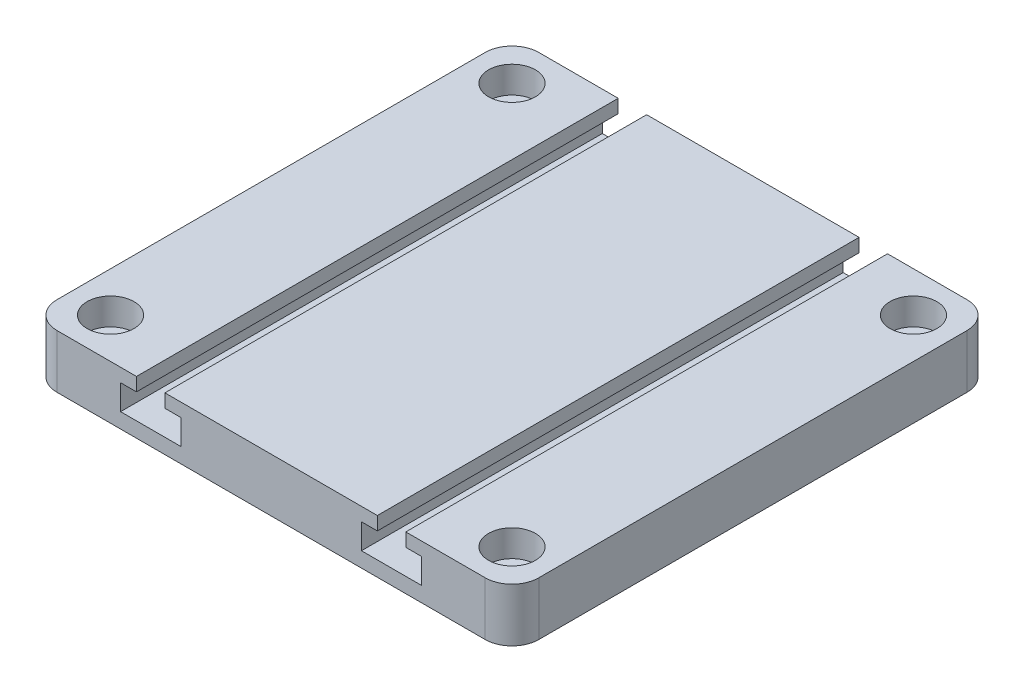
ISO-10303-21;
HEADER;
FILE_DESCRIPTION(('STEP AP214'),'2;1');
FILE_NAME('part.step','',(''),(''),'','','');
FILE_SCHEMA(('AUTOMOTIVE_DESIGN { 1 0 10303 214 1 1 1 1 }'));
ENDSEC;
DATA;
#1=APPLICATION_CONTEXT('core data for automotive mechanical design processes');
#2=APPLICATION_PROTOCOL_DEFINITION('international standard','automotive_design',2000,#1);
#3=PRODUCT_CONTEXT('',#1,'mechanical');
#4=PRODUCT('Part','Part','',(#3));
#5=PRODUCT_RELATED_PRODUCT_CATEGORY('part','',(#4));
#6=PRODUCT_DEFINITION_FORMATION('','',#4);
#7=PRODUCT_DEFINITION_CONTEXT('part definition',#1,'design');
#8=PRODUCT_DEFINITION('design','',#6,#7);
#9=PRODUCT_DEFINITION_SHAPE('','',#8);
#10=(LENGTH_UNIT() NAMED_UNIT(*) SI_UNIT(.MILLI.,.METRE.));
#11=(NAMED_UNIT(*) PLANE_ANGLE_UNIT() SI_UNIT($,.RADIAN.));
#12=(NAMED_UNIT(*) SI_UNIT($,.STERADIAN.) SOLID_ANGLE_UNIT());
#13=UNCERTAINTY_MEASURE_WITH_UNIT(LENGTH_MEASURE(1.E-05),#10,'distance_accuracy_value','');
#14=(GEOMETRIC_REPRESENTATION_CONTEXT(3) GLOBAL_UNCERTAINTY_ASSIGNED_CONTEXT((#13)) GLOBAL_UNIT_ASSIGNED_CONTEXT((#10,
#11,#12)) REPRESENTATION_CONTEXT('',''));
#15=CARTESIAN_POINT('',(0.,0.,0.));
#16=DIRECTION('',(0.,0.,1.));
#17=DIRECTION('',(1.,0.,0.));
#18=AXIS2_PLACEMENT_3D('',#15,#16,#17);
#19=CARTESIAN_POINT('',(0.,12.7,0.));
#20=DIRECTION('',(0.,1.,0.));
#21=DIRECTION('',(0.,0.,1.));
#22=AXIS2_PLACEMENT_3D('',#19,#20,#21);
#23=PLANE('',#22);
#24=DIRECTION('',(0.,0.,1.));
#25=VECTOR('',#24,1.);
#26=CARTESIAN_POINT('',(-25.2015625,12.7,-57.15));
#27=LINE('',#26,#25);
#28=CARTESIAN_POINT('',(-25.2015625,12.7,-57.15));
#29=VERTEX_POINT('',#28);
#30=CARTESIAN_POINT('',(-25.2015625,12.7,57.15));
#31=VERTEX_POINT('',#30);
#32=EDGE_CURVE('E276',#29,#31,#27,.T.);
#33=ORIENTED_EDGE('',*,*,#32,.T.);
#34=DIRECTION('',(1.,0.,0.));
#35=VECTOR('',#34,1.);
#36=CARTESIAN_POINT('',(-57.15,12.7,57.15));
#37=LINE('',#36,#35);
#38=CARTESIAN_POINT('',(25.2015625,12.7,57.15));
#39=VERTEX_POINT('',#38);
#40=EDGE_CURVE('E408',#31,#39,#37,.T.);
#41=ORIENTED_EDGE('',*,*,#40,.T.);
#42=DIRECTION('',(0.,0.,1.));
#43=VECTOR('',#42,1.);
#44=CARTESIAN_POINT('',(25.2015625,12.7,-57.15));
#45=LINE('',#44,#43);
#46=CARTESIAN_POINT('',(25.2015625,12.7,-57.15));
#47=VERTEX_POINT('',#46);
#48=EDGE_CURVE('E333',#47,#39,#45,.T.);
#49=ORIENTED_EDGE('',*,*,#48,.F.);
#50=DIRECTION('',(-1.,0.,0.));
#51=VECTOR('',#50,1.);
#52=CARTESIAN_POINT('',(-57.15,12.7,-57.15));
#53=LINE('',#52,#51);
#54=EDGE_CURVE('E401',#47,#29,#53,.T.);
#55=ORIENTED_EDGE('',*,*,#54,.T.);
#56=EDGE_LOOP('',(#33,#41,#49,#55));
#57=FACE_BOUND('',#56,.T.);
#58=ADVANCED_FACE('F54',(#57),#23,.T.);
#59=DIRECTION('',(0.,0.,1.));
#60=VECTOR('',#59,1.);
#61=CARTESIAN_POINT('',(-57.15,12.7,-57.15));
#62=LINE('',#61,#60);
#63=CARTESIAN_POINT('',(-57.15,12.7,-50.8));
#64=VERTEX_POINT('',#63);
#65=CARTESIAN_POINT('',(-57.15,12.7,50.8));
#66=VERTEX_POINT('',#65);
#67=EDGE_CURVE('E400',#64,#66,#62,.T.);
#68=ORIENTED_EDGE('',*,*,#67,.T.);
#69=CARTESIAN_POINT('',(-50.8,12.7,50.8));
#70=DIRECTION('',(0.,1.,0.));
#71=DIRECTION('',(0.,0.,1.));
#72=AXIS2_PLACEMENT_3D('',#69,#70,#71);
#73=CIRCLE('',#72,6.35);
#74=CARTESIAN_POINT('',(-50.8,12.7,57.15));
#75=VERTEX_POINT('',#74);
#76=EDGE_CURVE('E437',#66,#75,#73,.T.);
#77=ORIENTED_EDGE('',*,*,#76,.T.);
#78=CARTESIAN_POINT('',(-31.9484375,12.7,57.15));
#79=VERTEX_POINT('',#78);
#80=EDGE_CURVE('E405',#75,#79,#37,.T.);
#81=ORIENTED_EDGE('',*,*,#80,.T.);
#82=DIRECTION('',(0.,0.,1.));
#83=VECTOR('',#82,1.);
#84=CARTESIAN_POINT('',(-31.9484375,12.7,-57.15));
#85=LINE('',#84,#83);
#86=CARTESIAN_POINT('',(-31.9484375,12.7,-57.15));
#87=VERTEX_POINT('',#86);
#88=EDGE_CURVE('E229',#87,#79,#85,.T.);
#89=ORIENTED_EDGE('',*,*,#88,.F.);
#90=CARTESIAN_POINT('',(-50.8,12.7,-57.15));
#91=VERTEX_POINT('',#90);
#92=EDGE_CURVE('E242',#87,#91,#53,.T.);
#93=ORIENTED_EDGE('',*,*,#92,.T.);
#94=CARTESIAN_POINT('',(-50.8,12.7,-50.8));
#95=DIRECTION('',(0.,1.,0.));
#96=DIRECTION('',(0.,0.,1.));
#97=AXIS2_PLACEMENT_3D('',#94,#95,#96);
#98=CIRCLE('',#97,6.35);
#99=EDGE_CURVE('E435',#91,#64,#98,.T.);
#100=ORIENTED_EDGE('',*,*,#99,.T.);
#101=EDGE_LOOP('',(#68,#77,#81,#89,#93,#100));
#102=FACE_BOUND('',#101,.T.);
#103=CARTESIAN_POINT('',(-47.625,12.7,47.625));
#104=DIRECTION('',(0.,1.,0.));
#105=DIRECTION('',(0.,0.,1.));
#106=AXIS2_PLACEMENT_3D('',#103,#104,#105);
#107=CIRCLE('',#106,5.55625);
#108=CARTESIAN_POINT('',(-47.625,12.7,53.18125));
#109=VERTEX_POINT('',#108);
#110=EDGE_CURVE('E382',#109,#109,#107,.T.);
#111=ORIENTED_EDGE('',*,*,#110,.F.);
#112=EDGE_LOOP('',(#111));
#113=FACE_BOUND('',#112,.T.);
#114=CARTESIAN_POINT('',(-47.625,12.7,-47.625));
#115=DIRECTION('',(0.,1.,0.));
#116=DIRECTION('',(0.,0.,1.));
#117=AXIS2_PLACEMENT_3D('',#114,#115,#116);
#118=CIRCLE('',#117,5.55625);
#119=CARTESIAN_POINT('',(-47.625,12.7,-42.06875));
#120=VERTEX_POINT('',#119);
#121=EDGE_CURVE('E279',#120,#120,#118,.T.);
#122=ORIENTED_EDGE('',*,*,#121,.F.);
#123=EDGE_LOOP('',(#122));
#124=FACE_BOUND('',#123,.T.);
#125=ADVANCED_FACE('F450',(#102,#113,#124),#23,.T.);
#126=CARTESIAN_POINT('',(57.15,12.7,-57.15));
#127=DIRECTION('',(-1.,0.,0.));
#128=DIRECTION('',(0.,0.,1.));
#129=AXIS2_PLACEMENT_3D('',#126,#127,#128);
#130=PLANE('',#129);
#131=DIRECTION('',(0.,0.,-1.));
#132=VECTOR('',#131,1.);
#133=CARTESIAN_POINT('',(57.15,12.7,-57.15));
#134=LINE('',#133,#132);
#135=CARTESIAN_POINT('',(57.15,12.7,50.8));
#136=VERTEX_POINT('',#135);
#137=CARTESIAN_POINT('',(57.15,12.7,-50.8));
#138=VERTEX_POINT('',#137);
#139=EDGE_CURVE('E395',#136,#138,#134,.T.);
#140=ORIENTED_EDGE('',*,*,#139,.F.);
#141=DIRECTION('',(0.,-1.,0.));
#142=VECTOR('',#141,1.);
#143=CARTESIAN_POINT('',(57.15,12.7,50.8));
#144=LINE('',#143,#142);
#145=CARTESIAN_POINT('',(57.15,0.,50.8));
#146=VERTEX_POINT('',#145);
#147=EDGE_CURVE('E440',#136,#146,#144,.T.);
#148=ORIENTED_EDGE('',*,*,#147,.T.);
#149=DIRECTION('',(0.,0.,-1.));
#150=VECTOR('',#149,1.);
#151=CARTESIAN_POINT('',(57.15,0.,-57.15));
#152=LINE('',#151,#150);
#153=CARTESIAN_POINT('',(57.15,0.,-50.8));
#154=VERTEX_POINT('',#153);
#155=EDGE_CURVE('E394',#146,#154,#152,.T.);
#156=ORIENTED_EDGE('',*,*,#155,.T.);
#157=DIRECTION('',(0.,-1.,0.));
#158=VECTOR('',#157,1.);
#159=CARTESIAN_POINT('',(57.15,12.7,-50.8));
#160=LINE('',#159,#158);
#161=EDGE_CURVE('E77',#154,#138,#160,.F.);
#162=ORIENTED_EDGE('',*,*,#161,.T.);
#163=EDGE_LOOP('',(#140,#148,#156,#162));
#164=FACE_BOUND('',#163,.T.);
#165=ADVANCED_FACE('F529',(#164),#130,.F.);
#166=CARTESIAN_POINT('',(-57.15,12.7,-57.15));
#167=DIRECTION('',(0.,0.,1.));
#168=DIRECTION('',(1.,0.,0.));
#169=AXIS2_PLACEMENT_3D('',#166,#167,#168);
#170=PLANE('',#169);
#171=CARTESIAN_POINT('',(50.8,12.7,-57.15));
#172=VERTEX_POINT('',#171);
#173=CARTESIAN_POINT('',(31.9484375,12.7,-57.15));
#174=VERTEX_POINT('',#173);
#175=EDGE_CURVE('E398',#172,#174,#53,.T.);
#176=ORIENTED_EDGE('',*,*,#175,.F.);
#177=DIRECTION('',(0.,-1.,0.));
#178=VECTOR('',#177,1.);
#179=CARTESIAN_POINT('',(50.8,12.7,-57.15));
#180=LINE('',#179,#178);
#181=CARTESIAN_POINT('',(50.8,0.,-57.15));
#182=VERTEX_POINT('',#181);
#183=EDGE_CURVE('E13',#172,#182,#180,.T.);
#184=ORIENTED_EDGE('',*,*,#183,.T.);
#185=DIRECTION('',(-1.,0.,0.));
#186=VECTOR('',#185,1.);
#187=CARTESIAN_POINT('',(-57.15,0.,-57.15));
#188=LINE('',#187,#186);
#189=CARTESIAN_POINT('',(-50.8,0.,-57.15));
#190=VERTEX_POINT('',#189);
#191=EDGE_CURVE('E410',#182,#190,#188,.T.);
#192=ORIENTED_EDGE('',*,*,#191,.T.);
#193=DIRECTION('',(0.,-1.,0.));
#194=VECTOR('',#193,1.);
#195=CARTESIAN_POINT('',(-50.8,12.7,-57.15));
#196=LINE('',#195,#194);
#197=EDGE_CURVE('E62',#190,#91,#196,.F.);
#198=ORIENTED_EDGE('',*,*,#197,.T.);
#199=ORIENTED_EDGE('',*,*,#92,.F.);
#200=DIRECTION('',(0.,-1.,0.));
#201=VECTOR('',#200,1.);
#202=CARTESIAN_POINT('',(-31.9484375,12.7,-57.15));
#203=LINE('',#202,#201);
#204=CARTESIAN_POINT('',(-31.9484375,9.525,-57.15));
#205=VERTEX_POINT('',#204);
#206=EDGE_CURVE('E221',#87,#205,#203,.T.);
#207=ORIENTED_EDGE('',*,*,#206,.T.);
#208=DIRECTION('',(-1.,0.,0.));
#209=VECTOR('',#208,1.);
#210=CARTESIAN_POINT('',(-31.9484375,9.525,-57.15));
#211=LINE('',#210,#209);
#212=CARTESIAN_POINT('',(-35.71875,9.525,-57.15));
#213=VERTEX_POINT('',#212);
#214=EDGE_CURVE('E232',#205,#213,#211,.T.);
#215=ORIENTED_EDGE('',*,*,#214,.T.);
#216=DIRECTION('',(0.,-1.,0.));
#217=VECTOR('',#216,1.);
#218=CARTESIAN_POINT('',(-35.71875,9.525,-57.15));
#219=LINE('',#218,#217);
#220=CARTESIAN_POINT('',(-35.71875,3.571875,-57.15));
#221=VERTEX_POINT('',#220);
#222=EDGE_CURVE('E237',#213,#221,#219,.T.);
#223=ORIENTED_EDGE('',*,*,#222,.T.);
#224=DIRECTION('',(1.,0.,0.));
#225=VECTOR('',#224,1.);
#226=CARTESIAN_POINT('',(-35.71875,3.571875,-57.15));
#227=LINE('',#226,#225);
#228=CARTESIAN_POINT('',(-21.43125,3.571875,-57.15));
#229=VERTEX_POINT('',#228);
#230=EDGE_CURVE('E249',#221,#229,#227,.T.);
#231=ORIENTED_EDGE('',*,*,#230,.T.);
#232=DIRECTION('',(0.,1.,0.));
#233=VECTOR('',#232,1.);
#234=CARTESIAN_POINT('',(-21.43125,3.571875,-57.15));
#235=LINE('',#234,#233);
#236=CARTESIAN_POINT('',(-21.43125,9.525,-57.15));
#237=VERTEX_POINT('',#236);
#238=EDGE_CURVE('E252',#229,#237,#235,.T.);
#239=ORIENTED_EDGE('',*,*,#238,.T.);
#240=DIRECTION('',(-1.,0.,0.));
#241=VECTOR('',#240,1.);
#242=CARTESIAN_POINT('',(-21.43125,9.525,-57.15));
#243=LINE('',#242,#241);
#244=CARTESIAN_POINT('',(-25.2015625,9.525,-57.15));
#245=VERTEX_POINT('',#244);
#246=EDGE_CURVE('E255',#237,#245,#243,.T.);
#247=ORIENTED_EDGE('',*,*,#246,.T.);
#248=DIRECTION('',(0.,1.,0.));
#249=VECTOR('',#248,1.);
#250=CARTESIAN_POINT('',(-25.2015625,9.525,-57.15));
#251=LINE('',#250,#249);
#252=EDGE_CURVE('E258',#245,#29,#251,.T.);
#253=ORIENTED_EDGE('',*,*,#252,.T.);
#254=ORIENTED_EDGE('',*,*,#54,.F.);
#255=DIRECTION('',(0.,-1.,0.));
#256=VECTOR('',#255,1.);
#257=CARTESIAN_POINT('',(25.2015625,9.525,-57.15));
#258=LINE('',#257,#256);
#259=CARTESIAN_POINT('',(25.2015625,9.525,-57.15));
#260=VERTEX_POINT('',#259);
#261=EDGE_CURVE('E309',#47,#260,#258,.T.);
#262=ORIENTED_EDGE('',*,*,#261,.T.);
#263=DIRECTION('',(-1.,0.,0.));
#264=VECTOR('',#263,1.);
#265=CARTESIAN_POINT('',(21.43125,9.525,-57.15));
#266=LINE('',#265,#264);
#267=CARTESIAN_POINT('',(21.43125,9.525,-57.15));
#268=VERTEX_POINT('',#267);
#269=EDGE_CURVE('E290',#260,#268,#266,.T.);
#270=ORIENTED_EDGE('',*,*,#269,.T.);
#271=DIRECTION('',(0.,-1.,0.));
#272=VECTOR('',#271,1.);
#273=CARTESIAN_POINT('',(21.43125,3.571875,-57.15));
#274=LINE('',#273,#272);
#275=CARTESIAN_POINT('',(21.43125,3.571875,-57.15));
#276=VERTEX_POINT('',#275);
#277=EDGE_CURVE('E293',#268,#276,#274,.T.);
#278=ORIENTED_EDGE('',*,*,#277,.T.);
#279=DIRECTION('',(1.,0.,0.));
#280=VECTOR('',#279,1.);
#281=CARTESIAN_POINT('',(35.71875,3.571875,-57.15));
#282=LINE('',#281,#280);
#283=CARTESIAN_POINT('',(35.71875,3.571875,-57.15));
#284=VERTEX_POINT('',#283);
#285=EDGE_CURVE('E297',#276,#284,#282,.T.);
#286=ORIENTED_EDGE('',*,*,#285,.T.);
#287=DIRECTION('',(0.,1.,0.));
#288=VECTOR('',#287,1.);
#289=CARTESIAN_POINT('',(35.71875,9.525,-57.15));
#290=LINE('',#289,#288);
#291=CARTESIAN_POINT('',(35.71875,9.525,-57.15));
#292=VERTEX_POINT('',#291);
#293=EDGE_CURVE('E300',#284,#292,#290,.T.);
#294=ORIENTED_EDGE('',*,*,#293,.T.);
#295=DIRECTION('',(-1.,0.,0.));
#296=VECTOR('',#295,1.);
#297=CARTESIAN_POINT('',(31.9484375,9.525,-57.15));
#298=LINE('',#297,#296);
#299=CARTESIAN_POINT('',(31.9484375,9.525,-57.15));
#300=VERTEX_POINT('',#299);
#301=EDGE_CURVE('E303',#292,#300,#298,.T.);
#302=ORIENTED_EDGE('',*,*,#301,.T.);
#303=DIRECTION('',(0.,1.,0.));
#304=VECTOR('',#303,1.);
#305=CARTESIAN_POINT('',(31.9484375,12.7,-57.15));
#306=LINE('',#305,#304);
#307=EDGE_CURVE('E306',#300,#174,#306,.T.);
#308=ORIENTED_EDGE('',*,*,#307,.T.);
#309=EDGE_LOOP('',(#176,#184,#192,#198,#199,#207,#215,#223,#231,#239,#247,#253,#254,#262,#270,
#278,#286,#294,#302,#308));
#310=FACE_BOUND('',#309,.T.);
#311=ADVANCED_FACE('F240',(#310),#170,.F.);
#312=CARTESIAN_POINT('',(-57.15,12.7,-57.15));
#313=DIRECTION('',(1.,0.,0.));
#314=DIRECTION('',(0.,0.,-1.));
#315=AXIS2_PLACEMENT_3D('',#312,#313,#314);
#316=PLANE('',#315);
#317=DIRECTION('',(0.,0.,1.));
#318=VECTOR('',#317,1.);
#319=CARTESIAN_POINT('',(-57.15,0.,-57.15));
#320=LINE('',#319,#318);
#321=CARTESIAN_POINT('',(-57.15,0.,-50.8));
#322=VERTEX_POINT('',#321);
#323=CARTESIAN_POINT('',(-57.15,0.,50.8));
#324=VERTEX_POINT('',#323);
#325=EDGE_CURVE('E413',#322,#324,#320,.T.);
#326=ORIENTED_EDGE('',*,*,#325,.T.);
#327=DIRECTION('',(0.,-1.,0.));
#328=VECTOR('',#327,1.);
#329=CARTESIAN_POINT('',(-57.15,12.7,50.8));
#330=LINE('',#329,#328);
#331=EDGE_CURVE('E433',#324,#66,#330,.F.);
#332=ORIENTED_EDGE('',*,*,#331,.T.);
#333=ORIENTED_EDGE('',*,*,#67,.F.);
#334=DIRECTION('',(0.,-1.,0.));
#335=VECTOR('',#334,1.);
#336=CARTESIAN_POINT('',(-57.15,12.7,-50.8));
#337=LINE('',#336,#335);
#338=EDGE_CURVE('E430',#64,#322,#337,.T.);
#339=ORIENTED_EDGE('',*,*,#338,.T.);
#340=EDGE_LOOP('',(#326,#332,#333,#339));
#341=FACE_BOUND('',#340,.T.);
#342=ADVANCED_FACE('F456',(#341),#316,.F.);
#343=CARTESIAN_POINT('',(-57.15,12.7,57.15));
#344=DIRECTION('',(0.,0.,-1.));
#345=DIRECTION('',(-1.,0.,0.));
#346=AXIS2_PLACEMENT_3D('',#343,#344,#345);
#347=PLANE('',#346);
#348=ORIENTED_EDGE('',*,*,#80,.F.);
#349=DIRECTION('',(0.,-1.,0.));
#350=VECTOR('',#349,1.);
#351=CARTESIAN_POINT('',(-50.8,12.7,57.15));
#352=LINE('',#351,#350);
#353=CARTESIAN_POINT('',(-50.8,0.,57.15));
#354=VERTEX_POINT('',#353);
#355=EDGE_CURVE('E419',#75,#354,#352,.T.);
#356=ORIENTED_EDGE('',*,*,#355,.T.);
#357=DIRECTION('',(1.,0.,0.));
#358=VECTOR('',#357,1.);
#359=CARTESIAN_POINT('',(-57.15,0.,57.15));
#360=LINE('',#359,#358);
#361=CARTESIAN_POINT('',(50.8,0.,57.15));
#362=VERTEX_POINT('',#361);
#363=EDGE_CURVE('E397',#354,#362,#360,.T.);
#364=ORIENTED_EDGE('',*,*,#363,.T.);
#365=DIRECTION('',(0.,-1.,0.));
#366=VECTOR('',#365,1.);
#367=CARTESIAN_POINT('',(50.8,12.7,57.15));
#368=LINE('',#367,#366);
#369=CARTESIAN_POINT('',(50.8,12.7,57.15));
#370=VERTEX_POINT('',#369);
#371=EDGE_CURVE('E407',#362,#370,#368,.F.);
#372=ORIENTED_EDGE('',*,*,#371,.T.);
#373=CARTESIAN_POINT('',(31.9484375,12.7,57.15));
#374=VERTEX_POINT('',#373);
#375=EDGE_CURVE('E404',#374,#370,#37,.T.);
#376=ORIENTED_EDGE('',*,*,#375,.F.);
#377=DIRECTION('',(0.,1.,0.));
#378=VECTOR('',#377,1.);
#379=CARTESIAN_POINT('',(31.9484375,12.7,57.15));
#380=LINE('',#379,#378);
#381=CARTESIAN_POINT('',(31.9484375,9.525,57.15));
#382=VERTEX_POINT('',#381);
#383=EDGE_CURVE('E328',#382,#374,#380,.T.);
#384=ORIENTED_EDGE('',*,*,#383,.F.);
#385=DIRECTION('',(-1.,0.,0.));
#386=VECTOR('',#385,1.);
#387=CARTESIAN_POINT('',(31.9484375,9.525,57.15));
#388=LINE('',#387,#386);
#389=CARTESIAN_POINT('',(35.71875,9.525,57.15));
#390=VERTEX_POINT('',#389);
#391=EDGE_CURVE('E325',#390,#382,#388,.T.);
#392=ORIENTED_EDGE('',*,*,#391,.F.);
#393=DIRECTION('',(0.,1.,0.));
#394=VECTOR('',#393,1.);
#395=CARTESIAN_POINT('',(35.71875,9.525,57.15));
#396=LINE('',#395,#394);
#397=CARTESIAN_POINT('',(35.71875,3.571875,57.15));
#398=VERTEX_POINT('',#397);
#399=EDGE_CURVE('E322',#398,#390,#396,.T.);
#400=ORIENTED_EDGE('',*,*,#399,.F.);
#401=DIRECTION('',(1.,0.,0.));
#402=VECTOR('',#401,1.);
#403=CARTESIAN_POINT('',(35.71875,3.571875,57.15));
#404=LINE('',#403,#402);
#405=CARTESIAN_POINT('',(21.43125,3.571875,57.15));
#406=VERTEX_POINT('',#405);
#407=EDGE_CURVE('E319',#406,#398,#404,.T.);
#408=ORIENTED_EDGE('',*,*,#407,.F.);
#409=DIRECTION('',(0.,-1.,0.));
#410=VECTOR('',#409,1.);
#411=CARTESIAN_POINT('',(21.43125,3.571875,57.15));
#412=LINE('',#411,#410);
#413=CARTESIAN_POINT('',(21.43125,9.525,57.15));
#414=VERTEX_POINT('',#413);
#415=EDGE_CURVE('E316',#414,#406,#412,.T.);
#416=ORIENTED_EDGE('',*,*,#415,.F.);
#417=DIRECTION('',(-1.,0.,0.));
#418=VECTOR('',#417,1.);
#419=CARTESIAN_POINT('',(21.43125,9.525,57.15));
#420=LINE('',#419,#418);
#421=CARTESIAN_POINT('',(25.2015625,9.525,57.15));
#422=VERTEX_POINT('',#421);
#423=EDGE_CURVE('E313',#422,#414,#420,.T.);
#424=ORIENTED_EDGE('',*,*,#423,.F.);
#425=DIRECTION('',(0.,-1.,0.));
#426=VECTOR('',#425,1.);
#427=CARTESIAN_POINT('',(25.2015625,9.525,57.15));
#428=LINE('',#427,#426);
#429=EDGE_CURVE('E294',#39,#422,#428,.T.);
#430=ORIENTED_EDGE('',*,*,#429,.F.);
#431=ORIENTED_EDGE('',*,*,#40,.F.);
#432=DIRECTION('',(0.,1.,0.));
#433=VECTOR('',#432,1.);
#434=CARTESIAN_POINT('',(-25.2015625,9.525,57.15));
#435=LINE('',#434,#433);
#436=CARTESIAN_POINT('',(-25.2015625,9.525,57.15));
#437=VERTEX_POINT('',#436);
#438=EDGE_CURVE('E243',#437,#31,#435,.T.);
#439=ORIENTED_EDGE('',*,*,#438,.F.);
#440=DIRECTION('',(-1.,0.,0.));
#441=VECTOR('',#440,1.);
#442=CARTESIAN_POINT('',(-21.43125,9.525,57.15));
#443=LINE('',#442,#441);
#444=CARTESIAN_POINT('',(-21.43125,9.525,57.15));
#445=VERTEX_POINT('',#444);
#446=EDGE_CURVE('E245',#445,#437,#443,.T.);
#447=ORIENTED_EDGE('',*,*,#446,.F.);
#448=DIRECTION('',(0.,1.,0.));
#449=VECTOR('',#448,1.);
#450=CARTESIAN_POINT('',(-21.43125,3.571875,57.15));
#451=LINE('',#450,#449);
#452=CARTESIAN_POINT('',(-21.43125,3.571875,57.15));
#453=VERTEX_POINT('',#452);
#454=EDGE_CURVE('E271',#453,#445,#451,.T.);
#455=ORIENTED_EDGE('',*,*,#454,.F.);
#456=DIRECTION('',(1.,0.,0.));
#457=VECTOR('',#456,1.);
#458=CARTESIAN_POINT('',(-35.71875,3.571875,57.15));
#459=LINE('',#458,#457);
#460=CARTESIAN_POINT('',(-35.71875,3.571875,57.15));
#461=VERTEX_POINT('',#460);
#462=EDGE_CURVE('E268',#461,#453,#459,.T.);
#463=ORIENTED_EDGE('',*,*,#462,.F.);
#464=DIRECTION('',(0.,-1.,0.));
#465=VECTOR('',#464,1.);
#466=CARTESIAN_POINT('',(-35.71875,9.525,57.15));
#467=LINE('',#466,#465);
#468=CARTESIAN_POINT('',(-35.71875,9.525,57.15));
#469=VERTEX_POINT('',#468);
#470=EDGE_CURVE('E265',#469,#461,#467,.T.);
#471=ORIENTED_EDGE('',*,*,#470,.F.);
#472=DIRECTION('',(-1.,0.,0.));
#473=VECTOR('',#472,1.);
#474=CARTESIAN_POINT('',(-31.9484375,9.525,57.15));
#475=LINE('',#474,#473);
#476=CARTESIAN_POINT('',(-31.9484375,9.525,57.15));
#477=VERTEX_POINT('',#476);
#478=EDGE_CURVE('E262',#477,#469,#475,.T.);
#479=ORIENTED_EDGE('',*,*,#478,.F.);
#480=DIRECTION('',(0.,-1.,0.));
#481=VECTOR('',#480,1.);
#482=CARTESIAN_POINT('',(-31.9484375,12.7,57.15));
#483=LINE('',#482,#481);
#484=EDGE_CURVE('E224',#79,#477,#483,.T.);
#485=ORIENTED_EDGE('',*,*,#484,.F.);
#486=EDGE_LOOP('',(#348,#356,#364,#372,#376,#384,#392,#400,#408,#416,#424,#430,#431,#439,#447,
#455,#463,#471,#479,#485));
#487=FACE_BOUND('',#486,.T.);
#488=ADVANCED_FACE('F467',(#487),#347,.F.);
#489=ORIENTED_EDGE('',*,*,#375,.T.);
#490=CARTESIAN_POINT('',(50.8,12.7,50.8));
#491=DIRECTION('',(0.,1.,0.));
#492=DIRECTION('',(0.,0.,1.));
#493=AXIS2_PLACEMENT_3D('',#490,#491,#492);
#494=CIRCLE('',#493,6.35);
#495=EDGE_CURVE('E444',#370,#136,#494,.T.);
#496=ORIENTED_EDGE('',*,*,#495,.T.);
#497=ORIENTED_EDGE('',*,*,#139,.T.);
#498=CARTESIAN_POINT('',(50.8,12.7,-50.8));
#499=DIRECTION('',(0.,1.,0.));
#500=DIRECTION('',(0.,0.,1.));
#501=AXIS2_PLACEMENT_3D('',#498,#499,#500);
#502=CIRCLE('',#501,6.35);
#503=EDGE_CURVE('E69',#138,#172,#502,.T.);
#504=ORIENTED_EDGE('',*,*,#503,.T.);
#505=ORIENTED_EDGE('',*,*,#175,.T.);
#506=DIRECTION('',(0.,0.,1.));
#507=VECTOR('',#506,1.);
#508=CARTESIAN_POINT('',(31.9484375,12.7,-57.15));
#509=LINE('',#508,#507);
#510=EDGE_CURVE('E335',#174,#374,#509,.T.);
#511=ORIENTED_EDGE('',*,*,#510,.T.);
#512=EDGE_LOOP('',(#489,#496,#497,#504,#505,#511));
#513=FACE_BOUND('',#512,.T.);
#514=CARTESIAN_POINT('',(47.625,12.7,-47.625));
#515=DIRECTION('',(0.,1.,0.));
#516=DIRECTION('',(0.,0.,1.));
#517=AXIS2_PLACEMENT_3D('',#514,#515,#516);
#518=CIRCLE('',#517,5.55625);
#519=CARTESIAN_POINT('',(47.625,12.7,-42.06875));
#520=VERTEX_POINT('',#519);
#521=EDGE_CURVE('E358',#520,#520,#518,.T.);
#522=ORIENTED_EDGE('',*,*,#521,.F.);
#523=EDGE_LOOP('',(#522));
#524=FACE_BOUND('',#523,.T.);
#525=CARTESIAN_POINT('',(47.625,12.7,47.625));
#526=DIRECTION('',(0.,1.,0.));
#527=DIRECTION('',(0.,0.,1.));
#528=AXIS2_PLACEMENT_3D('',#525,#526,#527);
#529=CIRCLE('',#528,5.55625);
#530=CARTESIAN_POINT('',(47.625,12.7,53.18125));
#531=VERTEX_POINT('',#530);
#532=EDGE_CURVE('E370',#531,#531,#529,.T.);
#533=ORIENTED_EDGE('',*,*,#532,.F.);
#534=EDGE_LOOP('',(#533));
#535=FACE_BOUND('',#534,.T.);
#536=ADVANCED_FACE('F523',(#513,#524,#535),#23,.T.);
#537=CARTESIAN_POINT('',(0.,0.,0.));
#538=DIRECTION('',(0.,1.,0.));
#539=DIRECTION('',(0.,0.,1.));
#540=AXIS2_PLACEMENT_3D('',#537,#538,#539);
#541=PLANE('',#540);
#542=CARTESIAN_POINT('',(-47.625,0.,-47.625));
#543=DIRECTION('',(0.,1.,0.));
#544=DIRECTION('',(0.,0.,1.));
#545=AXIS2_PLACEMENT_3D('',#542,#543,#544);
#546=CIRCLE('',#545,3.2639);
#547=CARTESIAN_POINT('',(-47.625,0.,-44.3611));
#548=VERTEX_POINT('',#547);
#549=EDGE_CURVE('E355',#548,#548,#546,.T.);
#550=ORIENTED_EDGE('',*,*,#549,.T.);
#551=EDGE_LOOP('',(#550));
#552=FACE_BOUND('',#551,.T.);
#553=CARTESIAN_POINT('',(47.625,0.,-47.625));
#554=DIRECTION('',(0.,1.,0.));
#555=DIRECTION('',(0.,0.,1.));
#556=AXIS2_PLACEMENT_3D('',#553,#554,#555);
#557=CIRCLE('',#556,3.2639);
#558=CARTESIAN_POINT('',(47.625,0.,-44.3611));
#559=VERTEX_POINT('',#558);
#560=EDGE_CURVE('E367',#559,#559,#557,.T.);
#561=ORIENTED_EDGE('',*,*,#560,.T.);
#562=EDGE_LOOP('',(#561));
#563=FACE_BOUND('',#562,.T.);
#564=CARTESIAN_POINT('',(47.625,0.,47.625));
#565=DIRECTION('',(0.,1.,0.));
#566=DIRECTION('',(0.,0.,1.));
#567=AXIS2_PLACEMENT_3D('',#564,#565,#566);
#568=CIRCLE('',#567,3.2639);
#569=CARTESIAN_POINT('',(47.625,0.,50.8889));
#570=VERTEX_POINT('',#569);
#571=EDGE_CURVE('E379',#570,#570,#568,.T.);
#572=ORIENTED_EDGE('',*,*,#571,.T.);
#573=EDGE_LOOP('',(#572));
#574=FACE_BOUND('',#573,.T.);
#575=CARTESIAN_POINT('',(-47.625,0.,47.625));
#576=DIRECTION('',(0.,1.,0.));
#577=DIRECTION('',(0.,0.,1.));
#578=AXIS2_PLACEMENT_3D('',#575,#576,#577);
#579=CIRCLE('',#578,3.2639);
#580=CARTESIAN_POINT('',(-47.625,0.,50.8889));
#581=VERTEX_POINT('',#580);
#582=EDGE_CURVE('E391',#581,#581,#579,.T.);
#583=ORIENTED_EDGE('',*,*,#582,.T.);
#584=EDGE_LOOP('',(#583));
#585=FACE_BOUND('',#584,.T.);
#586=ORIENTED_EDGE('',*,*,#363,.F.);
#587=CARTESIAN_POINT('',(-50.8,0.,50.8));
#588=DIRECTION('',(0.,1.,0.));
#589=DIRECTION('',(0.,0.,1.));
#590=AXIS2_PLACEMENT_3D('',#587,#588,#589);
#591=CIRCLE('',#590,6.35);
#592=EDGE_CURVE('E428',#354,#324,#591,.F.);
#593=ORIENTED_EDGE('',*,*,#592,.T.);
#594=ORIENTED_EDGE('',*,*,#325,.F.);
#595=CARTESIAN_POINT('',(-50.8,0.,-50.8));
#596=DIRECTION('',(0.,1.,0.));
#597=DIRECTION('',(0.,0.,1.));
#598=AXIS2_PLACEMENT_3D('',#595,#596,#597);
#599=CIRCLE('',#598,6.35);
#600=EDGE_CURVE('E422',#322,#190,#599,.F.);
#601=ORIENTED_EDGE('',*,*,#600,.T.);
#602=ORIENTED_EDGE('',*,*,#191,.F.);
#603=CARTESIAN_POINT('',(50.8,0.,-50.8));
#604=DIRECTION('',(0.,1.,0.));
#605=DIRECTION('',(0.,0.,1.));
#606=AXIS2_PLACEMENT_3D('',#603,#604,#605);
#607=CIRCLE('',#606,6.35);
#608=EDGE_CURVE('E424',#182,#154,#607,.F.);
#609=ORIENTED_EDGE('',*,*,#608,.T.);
#610=ORIENTED_EDGE('',*,*,#155,.F.);
#611=CARTESIAN_POINT('',(50.8,0.,50.8));
#612=DIRECTION('',(0.,1.,0.));
#613=DIRECTION('',(0.,0.,1.));
#614=AXIS2_PLACEMENT_3D('',#611,#612,#613);
#615=CIRCLE('',#614,6.35);
#616=EDGE_CURVE('E426',#146,#362,#615,.F.);
#617=ORIENTED_EDGE('',*,*,#616,.T.);
#618=EDGE_LOOP('',(#586,#593,#594,#601,#602,#609,#610,#617));
#619=FACE_BOUND('',#618,.T.);
#620=ADVANCED_FACE('F460',(#552,#563,#574,#585,#619),#541,.F.);
#621=CARTESIAN_POINT('',(-47.625,12.7,47.625));
#622=DIRECTION('',(0.,1.,0.));
#623=DIRECTION('',(0.,0.,1.));
#624=AXIS2_PLACEMENT_3D('',#621,#622,#623);
#625=CYLINDRICAL_SURFACE('',#624,3.2639);
#626=ORIENTED_EDGE('',*,*,#582,.F.);
#627=EDGE_LOOP('',(#626));
#628=FACE_BOUND('',#627,.T.);
#629=CARTESIAN_POINT('',(-47.625,6.35,47.625));
#630=DIRECTION('',(0.,1.,0.));
#631=DIRECTION('',(0.,0.,1.));
#632=AXIS2_PLACEMENT_3D('',#629,#630,#631);
#633=CIRCLE('',#632,3.2639);
#634=CARTESIAN_POINT('',(-47.625,6.35,50.8889));
#635=VERTEX_POINT('',#634);
#636=EDGE_CURVE('E388',#635,#635,#633,.T.);
#637=ORIENTED_EDGE('',*,*,#636,.T.);
#638=EDGE_LOOP('',(#637));
#639=FACE_BOUND('',#638,.T.);
#640=ADVANCED_FACE('F552',(#628,#639),#625,.F.);
#641=CARTESIAN_POINT('',(-44.3611,6.35,47.625));
#642=DIRECTION('',(0.,-1.,0.));
#643=DIRECTION('',(0.,0.,-1.));
#644=AXIS2_PLACEMENT_3D('',#641,#642,#643);
#645=PLANE('',#644);
#646=ORIENTED_EDGE('',*,*,#636,.F.);
#647=EDGE_LOOP('',(#646));
#648=FACE_BOUND('',#647,.T.);
#649=CARTESIAN_POINT('',(-47.625,6.35,47.625));
#650=DIRECTION('',(0.,1.,0.));
#651=DIRECTION('',(0.,0.,1.));
#652=AXIS2_PLACEMENT_3D('',#649,#650,#651);
#653=CIRCLE('',#652,5.55625);
#654=CARTESIAN_POINT('',(-47.625,6.35,53.18125));
#655=VERTEX_POINT('',#654);
#656=EDGE_CURVE('E385',#655,#655,#653,.T.);
#657=ORIENTED_EDGE('',*,*,#656,.T.);
#658=EDGE_LOOP('',(#657));
#659=FACE_BOUND('',#658,.T.);
#660=ADVANCED_FACE('F629',(#648,#659),#645,.F.);
#661=CARTESIAN_POINT('',(-47.625,12.7,47.625));
#662=DIRECTION('',(0.,1.,0.));
#663=DIRECTION('',(0.,0.,1.));
#664=AXIS2_PLACEMENT_3D('',#661,#662,#663);
#665=CYLINDRICAL_SURFACE('',#664,5.55625);
#666=ORIENTED_EDGE('',*,*,#656,.F.);
#667=EDGE_LOOP('',(#666));
#668=FACE_BOUND('',#667,.T.);
#669=ORIENTED_EDGE('',*,*,#110,.T.);
#670=EDGE_LOOP('',(#669));
#671=FACE_BOUND('',#670,.T.);
#672=ADVANCED_FACE('F625',(#668,#671),#665,.F.);
#673=CARTESIAN_POINT('',(47.625,12.7,47.625));
#674=DIRECTION('',(0.,1.,0.));
#675=DIRECTION('',(0.,0.,1.));
#676=AXIS2_PLACEMENT_3D('',#673,#674,#675);
#677=CYLINDRICAL_SURFACE('',#676,3.2639);
#678=ORIENTED_EDGE('',*,*,#571,.F.);
#679=EDGE_LOOP('',(#678));
#680=FACE_BOUND('',#679,.T.);
#681=CARTESIAN_POINT('',(47.625,6.35,47.625));
#682=DIRECTION('',(0.,1.,0.));
#683=DIRECTION('',(0.,0.,1.));
#684=AXIS2_PLACEMENT_3D('',#681,#682,#683);
#685=CIRCLE('',#684,3.2639);
#686=CARTESIAN_POINT('',(47.625,6.35,50.8889));
#687=VERTEX_POINT('',#686);
#688=EDGE_CURVE('E376',#687,#687,#685,.T.);
#689=ORIENTED_EDGE('',*,*,#688,.T.);
#690=EDGE_LOOP('',(#689));
#691=FACE_BOUND('',#690,.T.);
#692=ADVANCED_FACE('F621',(#680,#691),#677,.F.);
#693=CARTESIAN_POINT('',(50.8889,6.35,47.625));
#694=DIRECTION('',(0.,-1.,0.));
#695=DIRECTION('',(0.,0.,-1.));
#696=AXIS2_PLACEMENT_3D('',#693,#694,#695);
#697=PLANE('',#696);
#698=ORIENTED_EDGE('',*,*,#688,.F.);
#699=EDGE_LOOP('',(#698));
#700=FACE_BOUND('',#699,.T.);
#701=CARTESIAN_POINT('',(47.625,6.35,47.625));
#702=DIRECTION('',(0.,1.,0.));
#703=DIRECTION('',(0.,0.,1.));
#704=AXIS2_PLACEMENT_3D('',#701,#702,#703);
#705=CIRCLE('',#704,5.55625);
#706=CARTESIAN_POINT('',(47.625,6.35,53.18125));
#707=VERTEX_POINT('',#706);
#708=EDGE_CURVE('E373',#707,#707,#705,.T.);
#709=ORIENTED_EDGE('',*,*,#708,.T.);
#710=EDGE_LOOP('',(#709));
#711=FACE_BOUND('',#710,.T.);
#712=ADVANCED_FACE('F617',(#700,#711),#697,.F.);
#713=CARTESIAN_POINT('',(47.625,12.7,47.625));
#714=DIRECTION('',(0.,1.,0.));
#715=DIRECTION('',(0.,0.,1.));
#716=AXIS2_PLACEMENT_3D('',#713,#714,#715);
#717=CYLINDRICAL_SURFACE('',#716,5.55625);
#718=ORIENTED_EDGE('',*,*,#708,.F.);
#719=EDGE_LOOP('',(#718));
#720=FACE_BOUND('',#719,.T.);
#721=ORIENTED_EDGE('',*,*,#532,.T.);
#722=EDGE_LOOP('',(#721));
#723=FACE_BOUND('',#722,.T.);
#724=ADVANCED_FACE('F613',(#720,#723),#717,.F.);
#725=CARTESIAN_POINT('',(47.625,12.7,-47.625));
#726=DIRECTION('',(0.,1.,0.));
#727=DIRECTION('',(0.,0.,1.));
#728=AXIS2_PLACEMENT_3D('',#725,#726,#727);
#729=CYLINDRICAL_SURFACE('',#728,3.2639);
#730=ORIENTED_EDGE('',*,*,#560,.F.);
#731=EDGE_LOOP('',(#730));
#732=FACE_BOUND('',#731,.T.);
#733=CARTESIAN_POINT('',(47.625,6.35,-47.625));
#734=DIRECTION('',(0.,1.,0.));
#735=DIRECTION('',(0.,0.,1.));
#736=AXIS2_PLACEMENT_3D('',#733,#734,#735);
#737=CIRCLE('',#736,3.2639);
#738=CARTESIAN_POINT('',(47.625,6.35,-44.3611));
#739=VERTEX_POINT('',#738);
#740=EDGE_CURVE('E364',#739,#739,#737,.T.);
#741=ORIENTED_EDGE('',*,*,#740,.T.);
#742=EDGE_LOOP('',(#741));
#743=FACE_BOUND('',#742,.T.);
#744=ADVANCED_FACE('F609',(#732,#743),#729,.F.);
#745=CARTESIAN_POINT('',(50.8889,6.35,-47.625));
#746=DIRECTION('',(0.,-1.,0.));
#747=DIRECTION('',(0.,0.,-1.));
#748=AXIS2_PLACEMENT_3D('',#745,#746,#747);
#749=PLANE('',#748);
#750=ORIENTED_EDGE('',*,*,#740,.F.);
#751=EDGE_LOOP('',(#750));
#752=FACE_BOUND('',#751,.T.);
#753=CARTESIAN_POINT('',(47.625,6.35,-47.625));
#754=DIRECTION('',(0.,1.,0.));
#755=DIRECTION('',(0.,0.,1.));
#756=AXIS2_PLACEMENT_3D('',#753,#754,#755);
#757=CIRCLE('',#756,5.55625);
#758=CARTESIAN_POINT('',(47.625,6.35,-42.06875));
#759=VERTEX_POINT('',#758);
#760=EDGE_CURVE('E361',#759,#759,#757,.T.);
#761=ORIENTED_EDGE('',*,*,#760,.T.);
#762=EDGE_LOOP('',(#761));
#763=FACE_BOUND('',#762,.T.);
#764=ADVANCED_FACE('F605',(#752,#763),#749,.F.);
#765=CARTESIAN_POINT('',(47.625,12.7,-47.625));
#766=DIRECTION('',(0.,1.,0.));
#767=DIRECTION('',(0.,0.,1.));
#768=AXIS2_PLACEMENT_3D('',#765,#766,#767);
#769=CYLINDRICAL_SURFACE('',#768,5.55625);
#770=ORIENTED_EDGE('',*,*,#760,.F.);
#771=EDGE_LOOP('',(#770));
#772=FACE_BOUND('',#771,.T.);
#773=ORIENTED_EDGE('',*,*,#521,.T.);
#774=EDGE_LOOP('',(#773));
#775=FACE_BOUND('',#774,.T.);
#776=ADVANCED_FACE('F601',(#772,#775),#769,.F.);
#777=CARTESIAN_POINT('',(-47.625,12.7,-47.625));
#778=DIRECTION('',(0.,1.,0.));
#779=DIRECTION('',(0.,0.,1.));
#780=AXIS2_PLACEMENT_3D('',#777,#778,#779);
#781=CYLINDRICAL_SURFACE('',#780,3.2639);
#782=ORIENTED_EDGE('',*,*,#549,.F.);
#783=EDGE_LOOP('',(#782));
#784=FACE_BOUND('',#783,.T.);
#785=CARTESIAN_POINT('',(-47.625,6.35,-47.625));
#786=DIRECTION('',(0.,1.,0.));
#787=DIRECTION('',(0.,0.,1.));
#788=AXIS2_PLACEMENT_3D('',#785,#786,#787);
#789=CIRCLE('',#788,3.2639);
#790=CARTESIAN_POINT('',(-47.625,6.35,-44.3611));
#791=VERTEX_POINT('',#790);
#792=EDGE_CURVE('E352',#791,#791,#789,.T.);
#793=ORIENTED_EDGE('',*,*,#792,.T.);
#794=EDGE_LOOP('',(#793));
#795=FACE_BOUND('',#794,.T.);
#796=ADVANCED_FACE('F597',(#784,#795),#781,.F.);
#797=CARTESIAN_POINT('',(-44.3611,6.35,-47.625));
#798=DIRECTION('',(0.,-1.,0.));
#799=DIRECTION('',(0.,0.,-1.));
#800=AXIS2_PLACEMENT_3D('',#797,#798,#799);
#801=PLANE('',#800);
#802=ORIENTED_EDGE('',*,*,#792,.F.);
#803=EDGE_LOOP('',(#802));
#804=FACE_BOUND('',#803,.T.);
#805=CARTESIAN_POINT('',(-47.625,6.35,-47.625));
#806=DIRECTION('',(0.,1.,0.));
#807=DIRECTION('',(0.,0.,1.));
#808=AXIS2_PLACEMENT_3D('',#805,#806,#807);
#809=CIRCLE('',#808,5.55625);
#810=CARTESIAN_POINT('',(-47.625,6.35,-42.06875));
#811=VERTEX_POINT('',#810);
#812=EDGE_CURVE('E349',#811,#811,#809,.T.);
#813=ORIENTED_EDGE('',*,*,#812,.T.);
#814=EDGE_LOOP('',(#813));
#815=FACE_BOUND('',#814,.T.);
#816=ADVANCED_FACE('F593',(#804,#815),#801,.F.);
#817=CARTESIAN_POINT('',(-47.625,12.7,-47.625));
#818=DIRECTION('',(0.,1.,0.));
#819=DIRECTION('',(0.,0.,1.));
#820=AXIS2_PLACEMENT_3D('',#817,#818,#819);
#821=CYLINDRICAL_SURFACE('',#820,5.55625);
#822=ORIENTED_EDGE('',*,*,#812,.F.);
#823=EDGE_LOOP('',(#822));
#824=FACE_BOUND('',#823,.T.);
#825=ORIENTED_EDGE('',*,*,#121,.T.);
#826=EDGE_LOOP('',(#825));
#827=FACE_BOUND('',#826,.T.);
#828=ADVANCED_FACE('F590',(#824,#827),#821,.F.);
#829=CARTESIAN_POINT('',(21.43125,9.525,-57.15));
#830=DIRECTION('',(0.,1.,0.));
#831=DIRECTION('',(-1.,0.,0.));
#832=AXIS2_PLACEMENT_3D('',#829,#830,#831);
#833=PLANE('',#832);
#834=ORIENTED_EDGE('',*,*,#423,.T.);
#835=DIRECTION('',(0.,0.,1.));
#836=VECTOR('',#835,1.);
#837=CARTESIAN_POINT('',(21.43125,9.525,-57.15));
#838=LINE('',#837,#836);
#839=EDGE_CURVE('E312',#268,#414,#838,.T.);
#840=ORIENTED_EDGE('',*,*,#839,.F.);
#841=ORIENTED_EDGE('',*,*,#269,.F.);
#842=DIRECTION('',(0.,0.,1.));
#843=VECTOR('',#842,1.);
#844=CARTESIAN_POINT('',(25.2015625,9.525,-57.15));
#845=LINE('',#844,#843);
#846=EDGE_CURVE('E263',#260,#422,#845,.T.);
#847=ORIENTED_EDGE('',*,*,#846,.T.);
#848=EDGE_LOOP('',(#834,#840,#841,#847));
#849=FACE_BOUND('',#848,.T.);
#850=ADVANCED_FACE('F500',(#849),#833,.F.);
#851=CARTESIAN_POINT('',(25.2015625,9.525,-57.15));
#852=DIRECTION('',(-1.,0.,0.));
#853=DIRECTION('',(0.,0.,1.));
#854=AXIS2_PLACEMENT_3D('',#851,#852,#853);
#855=PLANE('',#854);
#856=ORIENTED_EDGE('',*,*,#429,.T.);
#857=ORIENTED_EDGE('',*,*,#846,.F.);
#858=ORIENTED_EDGE('',*,*,#261,.F.);
#859=ORIENTED_EDGE('',*,*,#48,.T.);
#860=EDGE_LOOP('',(#856,#857,#858,#859));
#861=FACE_BOUND('',#860,.T.);
#862=ADVANCED_FACE('F494',(#861),#855,.F.);
#863=CARTESIAN_POINT('',(31.9484375,12.7,-57.15));
#864=DIRECTION('',(1.,0.,0.));
#865=DIRECTION('',(0.,0.,-1.));
#866=AXIS2_PLACEMENT_3D('',#863,#864,#865);
#867=PLANE('',#866);
#868=ORIENTED_EDGE('',*,*,#383,.T.);
#869=ORIENTED_EDGE('',*,*,#510,.F.);
#870=ORIENTED_EDGE('',*,*,#307,.F.);
#871=DIRECTION('',(0.,0.,1.));
#872=VECTOR('',#871,1.);
#873=CARTESIAN_POINT('',(31.9484375,9.525,-57.15));
#874=LINE('',#873,#872);
#875=EDGE_CURVE('E338',#300,#382,#874,.T.);
#876=ORIENTED_EDGE('',*,*,#875,.T.);
#877=EDGE_LOOP('',(#868,#869,#870,#876));
#878=FACE_BOUND('',#877,.T.);
#879=ADVANCED_FACE('F520',(#878),#867,.F.);
#880=CARTESIAN_POINT('',(31.9484375,9.525,-57.15));
#881=DIRECTION('',(0.,1.,0.));
#882=DIRECTION('',(-1.,0.,0.));
#883=AXIS2_PLACEMENT_3D('',#880,#881,#882);
#884=PLANE('',#883);
#885=ORIENTED_EDGE('',*,*,#391,.T.);
#886=ORIENTED_EDGE('',*,*,#875,.F.);
#887=ORIENTED_EDGE('',*,*,#301,.F.);
#888=DIRECTION('',(0.,0.,1.));
#889=VECTOR('',#888,1.);
#890=CARTESIAN_POINT('',(35.71875,9.525,-57.15));
#891=LINE('',#890,#889);
#892=EDGE_CURVE('E340',#292,#390,#891,.T.);
#893=ORIENTED_EDGE('',*,*,#892,.T.);
#894=EDGE_LOOP('',(#885,#886,#887,#893));
#895=FACE_BOUND('',#894,.T.);
#896=ADVANCED_FACE('F515',(#895),#884,.F.);
#897=CARTESIAN_POINT('',(35.71875,9.525,-57.15));
#898=DIRECTION('',(1.,0.,0.));
#899=DIRECTION('',(0.,0.,-1.));
#900=AXIS2_PLACEMENT_3D('',#897,#898,#899);
#901=PLANE('',#900);
#902=ORIENTED_EDGE('',*,*,#399,.T.);
#903=ORIENTED_EDGE('',*,*,#892,.F.);
#904=ORIENTED_EDGE('',*,*,#293,.F.);
#905=DIRECTION('',(0.,0.,1.));
#906=VECTOR('',#905,1.);
#907=CARTESIAN_POINT('',(35.71875,3.571875,-57.15));
#908=LINE('',#907,#906);
#909=EDGE_CURVE('E342',#284,#398,#908,.T.);
#910=ORIENTED_EDGE('',*,*,#909,.T.);
#911=EDGE_LOOP('',(#902,#903,#904,#910));
#912=FACE_BOUND('',#911,.T.);
#913=ADVANCED_FACE('F511',(#912),#901,.F.);
#914=CARTESIAN_POINT('',(35.71875,3.571875,-57.15));
#915=DIRECTION('',(0.,-1.,0.));
#916=DIRECTION('',(0.,0.,-1.));
#917=AXIS2_PLACEMENT_3D('',#914,#915,#916);
#918=PLANE('',#917);
#919=ORIENTED_EDGE('',*,*,#407,.T.);
#920=ORIENTED_EDGE('',*,*,#909,.F.);
#921=ORIENTED_EDGE('',*,*,#285,.F.);
#922=DIRECTION('',(0.,0.,1.));
#923=VECTOR('',#922,1.);
#924=CARTESIAN_POINT('',(21.43125,3.571875,-57.15));
#925=LINE('',#924,#923);
#926=EDGE_CURVE('E344',#276,#406,#925,.T.);
#927=ORIENTED_EDGE('',*,*,#926,.T.);
#928=EDGE_LOOP('',(#919,#920,#921,#927));
#929=FACE_BOUND('',#928,.T.);
#930=ADVANCED_FACE('F507',(#929),#918,.F.);
#931=CARTESIAN_POINT('',(21.43125,3.571875,-57.15));
#932=DIRECTION('',(-1.,0.,0.));
#933=DIRECTION('',(0.,0.,1.));
#934=AXIS2_PLACEMENT_3D('',#931,#932,#933);
#935=PLANE('',#934);
#936=ORIENTED_EDGE('',*,*,#415,.T.);
#937=ORIENTED_EDGE('',*,*,#926,.F.);
#938=ORIENTED_EDGE('',*,*,#277,.F.);
#939=ORIENTED_EDGE('',*,*,#839,.T.);
#940=EDGE_LOOP('',(#936,#937,#938,#939));
#941=FACE_BOUND('',#940,.T.);
#942=ADVANCED_FACE('F505',(#941),#935,.F.);
#943=CARTESIAN_POINT('',(-25.2015625,9.525,-57.15));
#944=DIRECTION('',(1.,0.,0.));
#945=DIRECTION('',(0.,0.,-1.));
#946=AXIS2_PLACEMENT_3D('',#943,#944,#945);
#947=PLANE('',#946);
#948=ORIENTED_EDGE('',*,*,#438,.T.);
#949=ORIENTED_EDGE('',*,*,#32,.F.);
#950=ORIENTED_EDGE('',*,*,#252,.F.);
#951=DIRECTION('',(0.,0.,1.));
#952=VECTOR('',#951,1.);
#953=CARTESIAN_POINT('',(-25.2015625,9.525,-57.15));
#954=LINE('',#953,#952);
#955=EDGE_CURVE('E280',#245,#437,#954,.T.);
#956=ORIENTED_EDGE('',*,*,#955,.T.);
#957=EDGE_LOOP('',(#948,#949,#950,#956));
#958=FACE_BOUND('',#957,.T.);
#959=ADVANCED_FACE('F587',(#958),#947,.F.);
#960=CARTESIAN_POINT('',(-21.43125,9.525,-57.15));
#961=DIRECTION('',(0.,1.,0.));
#962=DIRECTION('',(-1.,0.,0.));
#963=AXIS2_PLACEMENT_3D('',#960,#961,#962);
#964=PLANE('',#963);
#965=ORIENTED_EDGE('',*,*,#446,.T.);
#966=ORIENTED_EDGE('',*,*,#955,.F.);
#967=ORIENTED_EDGE('',*,*,#246,.F.);
#968=DIRECTION('',(0.,0.,1.));
#969=VECTOR('',#968,1.);
#970=CARTESIAN_POINT('',(-21.43125,9.525,-57.15));
#971=LINE('',#970,#969);
#972=EDGE_CURVE('E282',#237,#445,#971,.T.);
#973=ORIENTED_EDGE('',*,*,#972,.T.);
#974=EDGE_LOOP('',(#965,#966,#967,#973));
#975=FACE_BOUND('',#974,.T.);
#976=ADVANCED_FACE('F483',(#975),#964,.F.);
#977=CARTESIAN_POINT('',(-21.43125,3.571875,-57.15));
#978=DIRECTION('',(1.,0.,0.));
#979=DIRECTION('',(0.,0.,-1.));
#980=AXIS2_PLACEMENT_3D('',#977,#978,#979);
#981=PLANE('',#980);
#982=ORIENTED_EDGE('',*,*,#454,.T.);
#983=ORIENTED_EDGE('',*,*,#972,.F.);
#984=ORIENTED_EDGE('',*,*,#238,.F.);
#985=DIRECTION('',(0.,0.,1.));
#986=VECTOR('',#985,1.);
#987=CARTESIAN_POINT('',(-21.43125,3.571875,-57.15));
#988=LINE('',#987,#986);
#989=EDGE_CURVE('E284',#229,#453,#988,.T.);
#990=ORIENTED_EDGE('',*,*,#989,.T.);
#991=EDGE_LOOP('',(#982,#983,#984,#990));
#992=FACE_BOUND('',#991,.T.);
#993=ADVANCED_FACE('F479',(#992),#981,.F.);
#994=CARTESIAN_POINT('',(-35.71875,3.571875,-57.15));
#995=DIRECTION('',(0.,-1.,0.));
#996=DIRECTION('',(0.,0.,-1.));
#997=AXIS2_PLACEMENT_3D('',#994,#995,#996);
#998=PLANE('',#997);
#999=ORIENTED_EDGE('',*,*,#462,.T.);
#1000=ORIENTED_EDGE('',*,*,#989,.F.);
#1001=ORIENTED_EDGE('',*,*,#230,.F.);
#1002=DIRECTION('',(0.,0.,1.));
#1003=VECTOR('',#1002,1.);
#1004=CARTESIAN_POINT('',(-35.71875,3.571875,-57.15));
#1005=LINE('',#1004,#1003);
#1006=EDGE_CURVE('E286',#221,#461,#1005,.T.);
#1007=ORIENTED_EDGE('',*,*,#1006,.T.);
#1008=EDGE_LOOP('',(#999,#1000,#1001,#1007));
#1009=FACE_BOUND('',#1008,.T.);
#1010=ADVANCED_FACE('F477',(#1009),#998,.F.);
#1011=CARTESIAN_POINT('',(-35.71875,9.525,-57.15));
#1012=DIRECTION('',(-1.,0.,0.));
#1013=DIRECTION('',(0.,0.,1.));
#1014=AXIS2_PLACEMENT_3D('',#1011,#1012,#1013);
#1015=PLANE('',#1014);
#1016=ORIENTED_EDGE('',*,*,#470,.T.);
#1017=ORIENTED_EDGE('',*,*,#1006,.F.);
#1018=ORIENTED_EDGE('',*,*,#222,.F.);
#1019=DIRECTION('',(0.,0.,1.));
#1020=VECTOR('',#1019,1.);
#1021=CARTESIAN_POINT('',(-35.71875,9.525,-57.15));
#1022=LINE('',#1021,#1020);
#1023=EDGE_CURVE('E228',#213,#469,#1022,.T.);
#1024=ORIENTED_EDGE('',*,*,#1023,.T.);
#1025=EDGE_LOOP('',(#1016,#1017,#1018,#1024));
#1026=FACE_BOUND('',#1025,.T.);
#1027=ADVANCED_FACE('F473',(#1026),#1015,.F.);
#1028=CARTESIAN_POINT('',(-31.9484375,9.525,-57.15));
#1029=DIRECTION('',(0.,1.,0.));
#1030=DIRECTION('',(-1.,0.,0.));
#1031=AXIS2_PLACEMENT_3D('',#1028,#1029,#1030);
#1032=PLANE('',#1031);
#1033=ORIENTED_EDGE('',*,*,#478,.T.);
#1034=ORIENTED_EDGE('',*,*,#1023,.F.);
#1035=ORIENTED_EDGE('',*,*,#214,.F.);
#1036=DIRECTION('',(0.,0.,1.));
#1037=VECTOR('',#1036,1.);
#1038=CARTESIAN_POINT('',(-31.9484375,9.525,-57.15));
#1039=LINE('',#1038,#1037);
#1040=EDGE_CURVE('E216',#205,#477,#1039,.T.);
#1041=ORIENTED_EDGE('',*,*,#1040,.T.);
#1042=EDGE_LOOP('',(#1033,#1034,#1035,#1041));
#1043=FACE_BOUND('',#1042,.T.);
#1044=ADVANCED_FACE('F233',(#1043),#1032,.F.);
#1045=CARTESIAN_POINT('',(-31.9484375,12.7,-57.15));
#1046=DIRECTION('',(-1.,0.,0.));
#1047=DIRECTION('',(0.,0.,1.));
#1048=AXIS2_PLACEMENT_3D('',#1045,#1046,#1047);
#1049=PLANE('',#1048);
#1050=ORIENTED_EDGE('',*,*,#484,.T.);
#1051=ORIENTED_EDGE('',*,*,#1040,.F.);
#1052=ORIENTED_EDGE('',*,*,#206,.F.);
#1053=ORIENTED_EDGE('',*,*,#88,.T.);
#1054=EDGE_LOOP('',(#1050,#1051,#1052,#1053));
#1055=FACE_BOUND('',#1054,.T.);
#1056=ADVANCED_FACE('F218',(#1055),#1049,.F.);
#1057=CARTESIAN_POINT('',(-50.8,12.7,50.8));
#1058=DIRECTION('',(0.,-1.,0.));
#1059=DIRECTION('',(0.,0.,-1.));
#1060=AXIS2_PLACEMENT_3D('',#1057,#1058,#1059);
#1061=CYLINDRICAL_SURFACE('',#1060,6.35);
#1062=ORIENTED_EDGE('',*,*,#76,.F.);
#1063=ORIENTED_EDGE('',*,*,#331,.F.);
#1064=ORIENTED_EDGE('',*,*,#592,.F.);
#1065=ORIENTED_EDGE('',*,*,#355,.F.);
#1066=EDGE_LOOP('',(#1062,#1063,#1064,#1065));
#1067=FACE_BOUND('',#1066,.T.);
#1068=ADVANCED_FACE('F464',(#1067),#1061,.T.);
#1069=CARTESIAN_POINT('',(50.8,12.7,50.8));
#1070=DIRECTION('',(0.,-1.,0.));
#1071=DIRECTION('',(0.,0.,-1.));
#1072=AXIS2_PLACEMENT_3D('',#1069,#1070,#1071);
#1073=CYLINDRICAL_SURFACE('',#1072,6.35);
#1074=ORIENTED_EDGE('',*,*,#495,.F.);
#1075=ORIENTED_EDGE('',*,*,#371,.F.);
#1076=ORIENTED_EDGE('',*,*,#616,.F.);
#1077=ORIENTED_EDGE('',*,*,#147,.F.);
#1078=EDGE_LOOP('',(#1074,#1075,#1076,#1077));
#1079=FACE_BOUND('',#1078,.T.);
#1080=ADVANCED_FACE('F527',(#1079),#1073,.T.);
#1081=CARTESIAN_POINT('',(50.8,12.7,-50.8));
#1082=DIRECTION('',(0.,-1.,0.));
#1083=DIRECTION('',(0.,0.,-1.));
#1084=AXIS2_PLACEMENT_3D('',#1081,#1082,#1083);
#1085=CYLINDRICAL_SURFACE('',#1084,6.35);
#1086=ORIENTED_EDGE('',*,*,#503,.F.);
#1087=ORIENTED_EDGE('',*,*,#161,.F.);
#1088=ORIENTED_EDGE('',*,*,#608,.F.);
#1089=ORIENTED_EDGE('',*,*,#183,.F.);
#1090=EDGE_LOOP('',(#1086,#1087,#1088,#1089));
#1091=FACE_BOUND('',#1090,.T.);
#1092=ADVANCED_FACE('F533',(#1091),#1085,.T.);
#1093=CARTESIAN_POINT('',(-50.8,12.7,-50.8));
#1094=DIRECTION('',(0.,-1.,0.));
#1095=DIRECTION('',(0.,0.,-1.));
#1096=AXIS2_PLACEMENT_3D('',#1093,#1094,#1095);
#1097=CYLINDRICAL_SURFACE('',#1096,6.35);
#1098=ORIENTED_EDGE('',*,*,#99,.F.);
#1099=ORIENTED_EDGE('',*,*,#197,.F.);
#1100=ORIENTED_EDGE('',*,*,#600,.F.);
#1101=ORIENTED_EDGE('',*,*,#338,.F.);
#1102=EDGE_LOOP('',(#1098,#1099,#1100,#1101));
#1103=FACE_BOUND('',#1102,.T.);
#1104=ADVANCED_FACE('F56',(#1103),#1097,.T.);
#1105=CLOSED_SHELL('',(#58,#125,#165,#311,#342,#488,#536,#620,#640,#660,#672,#692,#712,#724,
#744,#764,#776,#796,#816,#828,#850,#862,#879,#896,#913,#930,#942,#959,#976,#993,#1010,#1027,
#1044,#1056,#1068,#1080,#1092,#1104));
#1106=MANIFOLD_SOLID_BREP('B2',#1105);
#1107=ADVANCED_BREP_SHAPE_REPRESENTATION('',(#18,#1106),#14);
#1108=SHAPE_DEFINITION_REPRESENTATION(#9,#1107);
ENDSEC;
END-ISO-10303-21;
